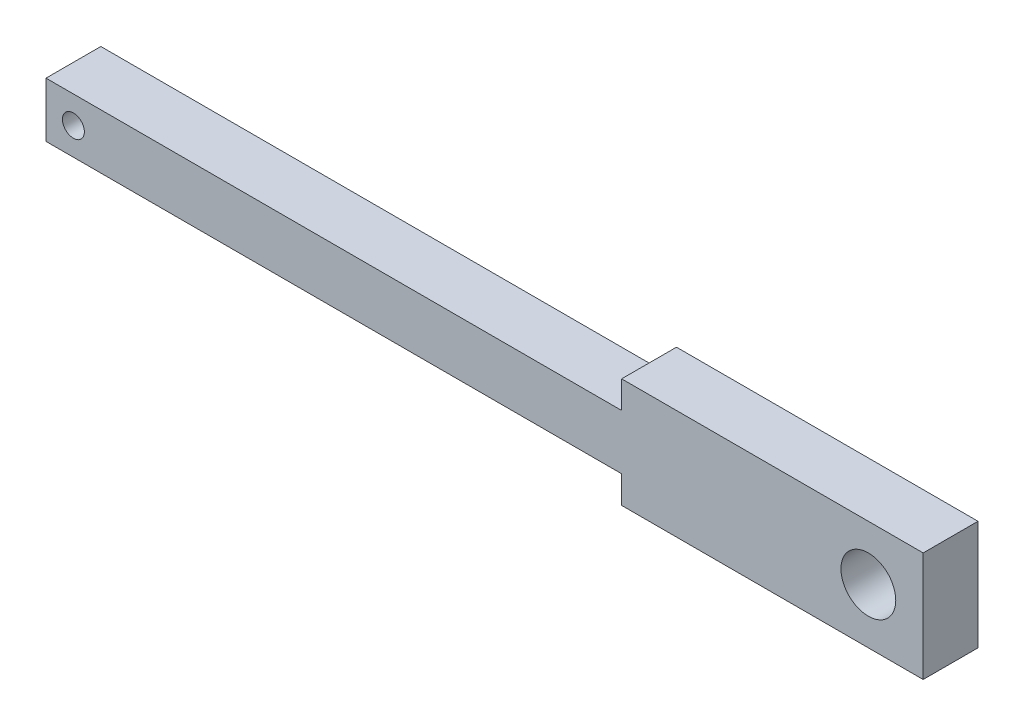
ISO-10303-21;
HEADER;
FILE_DESCRIPTION(('STEP AP214'),'2;1');
FILE_NAME('part.step','',(''),(''),'','','');
FILE_SCHEMA(('AUTOMOTIVE_DESIGN { 1 0 10303 214 1 1 1 1 }'));
ENDSEC;
DATA;
#1=APPLICATION_CONTEXT('core data for automotive mechanical design processes');
#2=APPLICATION_PROTOCOL_DEFINITION('international standard','automotive_design',2000,#1);
#3=PRODUCT_CONTEXT('',#1,'mechanical');
#4=PRODUCT('Part','Part','',(#3));
#5=PRODUCT_RELATED_PRODUCT_CATEGORY('part','',(#4));
#6=PRODUCT_DEFINITION_FORMATION('','',#4);
#7=PRODUCT_DEFINITION_CONTEXT('part definition',#1,'design');
#8=PRODUCT_DEFINITION('design','',#6,#7);
#9=PRODUCT_DEFINITION_SHAPE('','',#8);
#10=(LENGTH_UNIT() NAMED_UNIT(*) SI_UNIT(.MILLI.,.METRE.));
#11=(NAMED_UNIT(*) PLANE_ANGLE_UNIT() SI_UNIT($,.RADIAN.));
#12=(NAMED_UNIT(*) SI_UNIT($,.STERADIAN.) SOLID_ANGLE_UNIT());
#13=UNCERTAINTY_MEASURE_WITH_UNIT(LENGTH_MEASURE(1.E-05),#10,'distance_accuracy_value','');
#14=(GEOMETRIC_REPRESENTATION_CONTEXT(3) GLOBAL_UNCERTAINTY_ASSIGNED_CONTEXT((#13)) GLOBAL_UNIT_ASSIGNED_CONTEXT((#10,
#11,#12)) REPRESENTATION_CONTEXT('',''));
#15=CARTESIAN_POINT('',(0.,0.,0.));
#16=DIRECTION('',(0.,0.,1.));
#17=DIRECTION('',(1.,0.,0.));
#18=AXIS2_PLACEMENT_3D('',#15,#16,#17);
#19=CARTESIAN_POINT('',(160.,0.,10.));
#20=DIRECTION('',(1.,0.,0.));
#21=DIRECTION('',(0.,0.,-1.));
#22=AXIS2_PLACEMENT_3D('',#19,#20,#21);
#23=PLANE('',#22);
#24=DIRECTION('',(0.,-1.,0.));
#25=VECTOR('',#24,1.);
#26=CARTESIAN_POINT('',(160.,0.,0.));
#27=LINE('',#26,#25);
#28=CARTESIAN_POINT('',(160.,5.,0.));
#29=VERTEX_POINT('',#28);
#30=CARTESIAN_POINT('',(160.,-15.,0.));
#31=VERTEX_POINT('',#30);
#32=EDGE_CURVE('E157',#29,#31,#27,.T.);
#33=ORIENTED_EDGE('',*,*,#32,.F.);
#34=DIRECTION('',(0.,0.,-1.));
#35=VECTOR('',#34,1.);
#36=CARTESIAN_POINT('',(160.,5.,10.));
#37=LINE('',#36,#35);
#38=CARTESIAN_POINT('',(160.,5.,10.));
#39=VERTEX_POINT('',#38);
#40=EDGE_CURVE('E11',#39,#29,#37,.T.);
#41=ORIENTED_EDGE('',*,*,#40,.F.);
#42=DIRECTION('',(0.,-1.,0.));
#43=VECTOR('',#42,1.);
#44=CARTESIAN_POINT('',(160.,0.,10.));
#45=LINE('',#44,#43);
#46=CARTESIAN_POINT('',(160.,-15.,10.));
#47=VERTEX_POINT('',#46);
#48=EDGE_CURVE('E290',#39,#47,#45,.T.);
#49=ORIENTED_EDGE('',*,*,#48,.T.);
#50=DIRECTION('',(0.,0.,-1.));
#51=VECTOR('',#50,1.);
#52=CARTESIAN_POINT('',(160.,-15.,10.));
#53=LINE('',#52,#51);
#54=EDGE_CURVE('E58',#47,#31,#53,.T.);
#55=ORIENTED_EDGE('',*,*,#54,.T.);
#56=EDGE_LOOP('',(#33,#41,#49,#55));
#57=FACE_BOUND('',#56,.T.);
#58=ADVANCED_FACE('F41',(#57),#23,.T.);
#59=CARTESIAN_POINT('',(0.,4.99999999999999,10.));
#60=DIRECTION('',(0.,-1.,0.));
#61=DIRECTION('',(1.,0.,0.));
#62=AXIS2_PLACEMENT_3D('',#59,#60,#61);
#63=PLANE('',#62);
#64=DIRECTION('',(-1.,0.,0.));
#65=VECTOR('',#64,1.);
#66=CARTESIAN_POINT('',(0.,4.99999999999999,0.));
#67=LINE('',#66,#65);
#68=CARTESIAN_POINT('',(105.,5.,0.));
#69=VERTEX_POINT('',#68);
#70=EDGE_CURVE('E154',#29,#69,#67,.T.);
#71=ORIENTED_EDGE('',*,*,#70,.T.);
#72=DIRECTION('',(0.,0.,-1.));
#73=VECTOR('',#72,1.);
#74=CARTESIAN_POINT('',(105.,5.,10.));
#75=LINE('',#74,#73);
#76=CARTESIAN_POINT('',(105.,5.,10.));
#77=VERTEX_POINT('',#76);
#78=EDGE_CURVE('E50',#77,#69,#75,.T.);
#79=ORIENTED_EDGE('',*,*,#78,.F.);
#80=DIRECTION('',(-1.,0.,0.));
#81=VECTOR('',#80,1.);
#82=CARTESIAN_POINT('',(0.,4.99999999999999,10.));
#83=LINE('',#82,#81);
#84=EDGE_CURVE('E292',#39,#77,#83,.T.);
#85=ORIENTED_EDGE('',*,*,#84,.F.);
#86=ORIENTED_EDGE('',*,*,#40,.T.);
#87=EDGE_LOOP('',(#71,#79,#85,#86));
#88=FACE_BOUND('',#87,.T.);
#89=ADVANCED_FACE('F155',(#88),#63,.F.);
#90=CARTESIAN_POINT('',(105.,0.,10.));
#91=DIRECTION('',(-1.,0.,0.));
#92=DIRECTION('',(0.,0.,1.));
#93=AXIS2_PLACEMENT_3D('',#90,#91,#92);
#94=PLANE('',#93);
#95=DIRECTION('',(0.,1.,0.));
#96=VECTOR('',#95,1.);
#97=CARTESIAN_POINT('',(105.,0.,0.));
#98=LINE('',#97,#96);
#99=CARTESIAN_POINT('',(105.,0.,0.));
#100=VERTEX_POINT('',#99);
#101=EDGE_CURVE('E148',#100,#69,#98,.T.);
#102=ORIENTED_EDGE('',*,*,#101,.F.);
#103=DIRECTION('',(0.,0.,-1.));
#104=VECTOR('',#103,1.);
#105=CARTESIAN_POINT('',(105.,0.,10.));
#106=LINE('',#105,#104);
#107=CARTESIAN_POINT('',(105.,0.,10.));
#108=VERTEX_POINT('',#107);
#109=EDGE_CURVE('E140',#108,#100,#106,.T.);
#110=ORIENTED_EDGE('',*,*,#109,.F.);
#111=DIRECTION('',(0.,1.,0.));
#112=VECTOR('',#111,1.);
#113=CARTESIAN_POINT('',(105.,0.,10.));
#114=LINE('',#113,#112);
#115=EDGE_CURVE('E151',#108,#77,#114,.T.);
#116=ORIENTED_EDGE('',*,*,#115,.T.);
#117=ORIENTED_EDGE('',*,*,#78,.T.);
#118=EDGE_LOOP('',(#102,#110,#116,#117));
#119=FACE_BOUND('',#118,.T.);
#120=ADVANCED_FACE('F146',(#119),#94,.T.);
#121=CARTESIAN_POINT('',(0.,0.,10.));
#122=DIRECTION('',(0.,1.,0.));
#123=DIRECTION('',(-1.,0.,0.));
#124=AXIS2_PLACEMENT_3D('',#121,#122,#123);
#125=PLANE('',#124);
#126=DIRECTION('',(1.,0.,0.));
#127=VECTOR('',#126,1.);
#128=CARTESIAN_POINT('',(0.,0.,0.));
#129=LINE('',#128,#127);
#130=CARTESIAN_POINT('',(0.,0.,0.));
#131=VERTEX_POINT('',#130);
#132=EDGE_CURVE('E163',#131,#100,#129,.T.);
#133=ORIENTED_EDGE('',*,*,#132,.F.);
#134=DIRECTION('',(0.,0.,-1.));
#135=VECTOR('',#134,1.);
#136=CARTESIAN_POINT('',(0.,0.,10.));
#137=LINE('',#136,#135);
#138=CARTESIAN_POINT('',(0.,0.,10.));
#139=VERTEX_POINT('',#138);
#140=EDGE_CURVE('E134',#139,#131,#137,.T.);
#141=ORIENTED_EDGE('',*,*,#140,.F.);
#142=DIRECTION('',(1.,0.,0.));
#143=VECTOR('',#142,1.);
#144=CARTESIAN_POINT('',(0.,0.,10.));
#145=LINE('',#144,#143);
#146=EDGE_CURVE('E297',#139,#108,#145,.T.);
#147=ORIENTED_EDGE('',*,*,#146,.T.);
#148=ORIENTED_EDGE('',*,*,#109,.T.);
#149=EDGE_LOOP('',(#133,#141,#147,#148));
#150=FACE_BOUND('',#149,.T.);
#151=ADVANCED_FACE('F208',(#150),#125,.T.);
#152=CARTESIAN_POINT('',(0.,0.,10.));
#153=DIRECTION('',(1.,0.,0.));
#154=DIRECTION('',(0.,1.,0.));
#155=AXIS2_PLACEMENT_3D('',#152,#153,#154);
#156=PLANE('',#155);
#157=DIRECTION('',(0.,-1.,0.));
#158=VECTOR('',#157,1.);
#159=CARTESIAN_POINT('',(0.,0.,0.));
#160=LINE('',#159,#158);
#161=CARTESIAN_POINT('',(0.,-9.99999999999999,0.));
#162=VERTEX_POINT('',#161);
#163=EDGE_CURVE('E165',#131,#162,#160,.T.);
#164=ORIENTED_EDGE('',*,*,#163,.T.);
#165=DIRECTION('',(0.,0.,-1.));
#166=VECTOR('',#165,1.);
#167=CARTESIAN_POINT('',(0.,-9.99999999999999,10.));
#168=LINE('',#167,#166);
#169=CARTESIAN_POINT('',(0.,-9.99999999999999,10.));
#170=VERTEX_POINT('',#169);
#171=EDGE_CURVE('E132',#170,#162,#168,.T.);
#172=ORIENTED_EDGE('',*,*,#171,.F.);
#173=DIRECTION('',(0.,-1.,0.));
#174=VECTOR('',#173,1.);
#175=CARTESIAN_POINT('',(0.,0.,10.));
#176=LINE('',#175,#174);
#177=EDGE_CURVE('E125',#139,#170,#176,.T.);
#178=ORIENTED_EDGE('',*,*,#177,.F.);
#179=ORIENTED_EDGE('',*,*,#140,.T.);
#180=EDGE_LOOP('',(#164,#172,#178,#179));
#181=FACE_BOUND('',#180,.T.);
#182=ADVANCED_FACE('F211',(#181),#156,.F.);
#183=CARTESIAN_POINT('',(0.,-9.99999999999999,10.));
#184=DIRECTION('',(0.,1.,0.));
#185=DIRECTION('',(0.,0.,1.));
#186=AXIS2_PLACEMENT_3D('',#183,#184,#185);
#187=PLANE('',#186);
#188=DIRECTION('',(1.,0.,0.));
#189=VECTOR('',#188,1.);
#190=CARTESIAN_POINT('',(0.,-9.99999999999999,0.));
#191=LINE('',#190,#189);
#192=CARTESIAN_POINT('',(105.,-9.99999999999999,0.));
#193=VERTEX_POINT('',#192);
#194=EDGE_CURVE('E131',#162,#193,#191,.T.);
#195=ORIENTED_EDGE('',*,*,#194,.T.);
#196=DIRECTION('',(0.,0.,-1.));
#197=VECTOR('',#196,1.);
#198=CARTESIAN_POINT('',(105.,-9.99999999999999,10.));
#199=LINE('',#198,#197);
#200=CARTESIAN_POINT('',(105.,-9.99999999999999,10.));
#201=VERTEX_POINT('',#200);
#202=EDGE_CURVE('E112',#201,#193,#199,.T.);
#203=ORIENTED_EDGE('',*,*,#202,.F.);
#204=DIRECTION('',(1.,0.,0.));
#205=VECTOR('',#204,1.);
#206=CARTESIAN_POINT('',(0.,-9.99999999999999,10.));
#207=LINE('',#206,#205);
#208=EDGE_CURVE('E117',#170,#201,#207,.T.);
#209=ORIENTED_EDGE('',*,*,#208,.F.);
#210=ORIENTED_EDGE('',*,*,#171,.T.);
#211=EDGE_LOOP('',(#195,#203,#209,#210));
#212=FACE_BOUND('',#211,.T.);
#213=ADVANCED_FACE('F130',(#212),#187,.F.);
#214=CARTESIAN_POINT('',(105.,0.,10.));
#215=DIRECTION('',(1.,0.,0.));
#216=DIRECTION('',(0.,0.,-1.));
#217=AXIS2_PLACEMENT_3D('',#214,#215,#216);
#218=PLANE('',#217);
#219=DIRECTION('',(0.,-1.,0.));
#220=VECTOR('',#219,1.);
#221=CARTESIAN_POINT('',(105.,0.,0.));
#222=LINE('',#221,#220);
#223=CARTESIAN_POINT('',(105.,-15.,0.));
#224=VERTEX_POINT('',#223);
#225=EDGE_CURVE('E172',#193,#224,#222,.T.);
#226=ORIENTED_EDGE('',*,*,#225,.T.);
#227=DIRECTION('',(0.,0.,-1.));
#228=VECTOR('',#227,1.);
#229=CARTESIAN_POINT('',(105.,-15.,10.));
#230=LINE('',#229,#228);
#231=CARTESIAN_POINT('',(105.,-15.,10.));
#232=VERTEX_POINT('',#231);
#233=EDGE_CURVE('E84',#232,#224,#230,.T.);
#234=ORIENTED_EDGE('',*,*,#233,.F.);
#235=DIRECTION('',(0.,-1.,0.));
#236=VECTOR('',#235,1.);
#237=CARTESIAN_POINT('',(105.,0.,10.));
#238=LINE('',#237,#236);
#239=EDGE_CURVE('E108',#201,#232,#238,.T.);
#240=ORIENTED_EDGE('',*,*,#239,.F.);
#241=ORIENTED_EDGE('',*,*,#202,.T.);
#242=EDGE_LOOP('',(#226,#234,#240,#241));
#243=FACE_BOUND('',#242,.T.);
#244=ADVANCED_FACE('F110',(#243),#218,.F.);
#245=CARTESIAN_POINT('',(0.,-15.,10.));
#246=DIRECTION('',(0.,-1.,0.));
#247=DIRECTION('',(1.,0.,0.));
#248=AXIS2_PLACEMENT_3D('',#245,#246,#247);
#249=PLANE('',#248);
#250=DIRECTION('',(-1.,0.,0.));
#251=VECTOR('',#250,1.);
#252=CARTESIAN_POINT('',(0.,-15.,0.));
#253=LINE('',#252,#251);
#254=EDGE_CURVE('E174',#31,#224,#253,.T.);
#255=ORIENTED_EDGE('',*,*,#254,.F.);
#256=ORIENTED_EDGE('',*,*,#54,.F.);
#257=DIRECTION('',(-1.,0.,0.));
#258=VECTOR('',#257,1.);
#259=CARTESIAN_POINT('',(0.,-15.,10.));
#260=LINE('',#259,#258);
#261=EDGE_CURVE('E116',#47,#232,#260,.T.);
#262=ORIENTED_EDGE('',*,*,#261,.T.);
#263=ORIENTED_EDGE('',*,*,#233,.T.);
#264=EDGE_LOOP('',(#255,#256,#262,#263));
#265=FACE_BOUND('',#264,.T.);
#266=ADVANCED_FACE('F189',(#265),#249,.T.);
#267=CARTESIAN_POINT('',(150.,-5.,10.));
#268=DIRECTION('',(0.,0.,-1.));
#269=DIRECTION('',(-1.,0.,0.));
#270=AXIS2_PLACEMENT_3D('',#267,#268,#269);
#271=CYLINDRICAL_SURFACE('',#270,5.00000000000002);
#272=CARTESIAN_POINT('',(150.,-5.,10.));
#273=DIRECTION('',(0.,0.,1.));
#274=DIRECTION('',(1.,0.,0.));
#275=AXIS2_PLACEMENT_3D('',#272,#273,#274);
#276=CIRCLE('',#275,5.00000000000002);
#277=CARTESIAN_POINT('',(155.,-5.,10.));
#278=VERTEX_POINT('',#277);
#279=EDGE_CURVE('E179',#278,#278,#276,.F.);
#280=ORIENTED_EDGE('',*,*,#279,.F.);
#281=EDGE_LOOP('',(#280));
#282=FACE_BOUND('',#281,.T.);
#283=CARTESIAN_POINT('',(150.,-5.,0.));
#284=DIRECTION('',(0.,0.,1.));
#285=DIRECTION('',(1.,0.,0.));
#286=AXIS2_PLACEMENT_3D('',#283,#284,#285);
#287=CIRCLE('',#286,5.00000000000002);
#288=CARTESIAN_POINT('',(155.,-5.,0.));
#289=VERTEX_POINT('',#288);
#290=EDGE_CURVE('E187',#289,#289,#287,.F.);
#291=ORIENTED_EDGE('',*,*,#290,.T.);
#292=EDGE_LOOP('',(#291));
#293=FACE_BOUND('',#292,.T.);
#294=ADVANCED_FACE('F43',(#282,#293),#271,.F.);
#295=CARTESIAN_POINT('',(5.,-5.,10.));
#296=DIRECTION('',(0.,0.,-1.));
#297=DIRECTION('',(-1.,0.,0.));
#298=AXIS2_PLACEMENT_3D('',#295,#296,#297);
#299=CYLINDRICAL_SURFACE('',#298,2.);
#300=CARTESIAN_POINT('',(5.,-5.,10.));
#301=DIRECTION('',(0.,0.,1.));
#302=DIRECTION('',(1.,0.,0.));
#303=AXIS2_PLACEMENT_3D('',#300,#301,#302);
#304=CIRCLE('',#303,2.);
#305=CARTESIAN_POINT('',(7.,-5.,10.));
#306=VERTEX_POINT('',#305);
#307=EDGE_CURVE('E180',#306,#306,#304,.T.);
#308=ORIENTED_EDGE('',*,*,#307,.T.);
#309=EDGE_LOOP('',(#308));
#310=FACE_BOUND('',#309,.T.);
#311=CARTESIAN_POINT('',(5.,-5.,0.));
#312=DIRECTION('',(0.,0.,1.));
#313=DIRECTION('',(1.,0.,0.));
#314=AXIS2_PLACEMENT_3D('',#311,#312,#313);
#315=CIRCLE('',#314,2.);
#316=CARTESIAN_POINT('',(7.,-5.,0.));
#317=VERTEX_POINT('',#316);
#318=EDGE_CURVE('E177',#317,#317,#315,.T.);
#319=ORIENTED_EDGE('',*,*,#318,.F.);
#320=EDGE_LOOP('',(#319));
#321=FACE_BOUND('',#320,.T.);
#322=ADVANCED_FACE('F196',(#310,#321),#299,.F.);
#323=CARTESIAN_POINT('',(0.,0.,10.));
#324=DIRECTION('',(0.,0.,1.));
#325=DIRECTION('',(1.,0.,0.));
#326=AXIS2_PLACEMENT_3D('',#323,#324,#325);
#327=PLANE('',#326);
#328=ORIENTED_EDGE('',*,*,#279,.T.);
#329=EDGE_LOOP('',(#328));
#330=FACE_BOUND('',#329,.T.);
#331=ORIENTED_EDGE('',*,*,#48,.F.);
#332=ORIENTED_EDGE('',*,*,#84,.T.);
#333=ORIENTED_EDGE('',*,*,#115,.F.);
#334=ORIENTED_EDGE('',*,*,#146,.F.);
#335=ORIENTED_EDGE('',*,*,#177,.T.);
#336=ORIENTED_EDGE('',*,*,#208,.T.);
#337=ORIENTED_EDGE('',*,*,#239,.T.);
#338=ORIENTED_EDGE('',*,*,#261,.F.);
#339=EDGE_LOOP('',(#331,#332,#333,#334,#335,#336,#337,#338));
#340=FACE_BOUND('',#339,.T.);
#341=ORIENTED_EDGE('',*,*,#307,.F.);
#342=EDGE_LOOP('',(#341));
#343=FACE_BOUND('',#342,.T.);
#344=ADVANCED_FACE('F121',(#330,#340,#343),#327,.T.);
#345=CARTESIAN_POINT('',(0.,0.,0.));
#346=DIRECTION('',(0.,0.,1.));
#347=DIRECTION('',(1.,0.,0.));
#348=AXIS2_PLACEMENT_3D('',#345,#346,#347);
#349=PLANE('',#348);
#350=ORIENTED_EDGE('',*,*,#290,.F.);
#351=EDGE_LOOP('',(#350));
#352=FACE_BOUND('',#351,.T.);
#353=ORIENTED_EDGE('',*,*,#32,.T.);
#354=ORIENTED_EDGE('',*,*,#254,.T.);
#355=ORIENTED_EDGE('',*,*,#225,.F.);
#356=ORIENTED_EDGE('',*,*,#194,.F.);
#357=ORIENTED_EDGE('',*,*,#163,.F.);
#358=ORIENTED_EDGE('',*,*,#132,.T.);
#359=ORIENTED_EDGE('',*,*,#101,.T.);
#360=ORIENTED_EDGE('',*,*,#70,.F.);
#361=EDGE_LOOP('',(#353,#354,#355,#356,#357,#358,#359,#360));
#362=FACE_BOUND('',#361,.T.);
#363=ORIENTED_EDGE('',*,*,#318,.T.);
#364=EDGE_LOOP('',(#363));
#365=FACE_BOUND('',#364,.T.);
#366=ADVANCED_FACE('F159',(#352,#362,#365),#349,.F.);
#367=CLOSED_SHELL('',(#58,#89,#120,#151,#182,#213,#244,#266,#294,#322,#344,#366));
#368=MANIFOLD_SOLID_BREP('B2',#367);
#369=ADVANCED_BREP_SHAPE_REPRESENTATION('',(#18,#368),#14);
#370=SHAPE_DEFINITION_REPRESENTATION(#9,#369);
ENDSEC;
END-ISO-10303-21;
